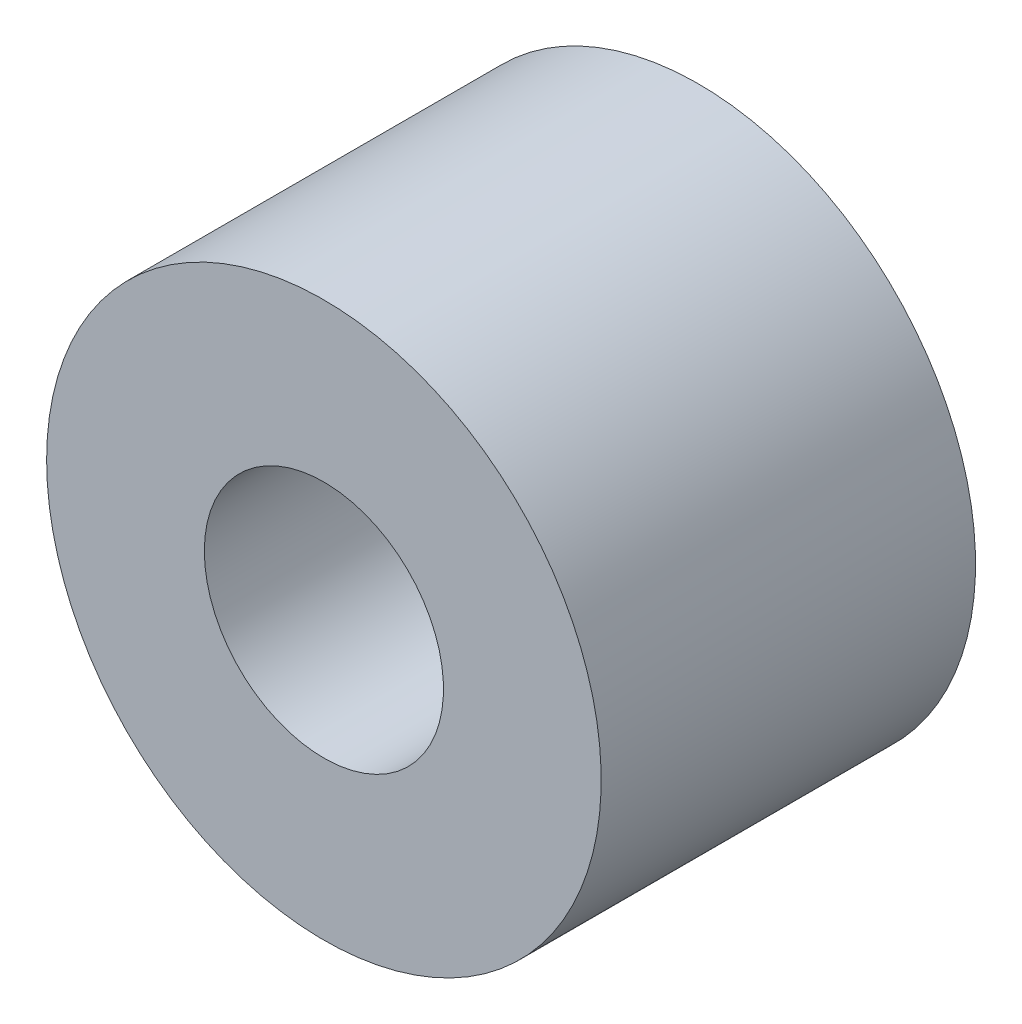
ISO-10303-21;
HEADER;
FILE_DESCRIPTION(('STEP AP214'),'2;1');
FILE_NAME('part.step','',(''),(''),'','','');
FILE_SCHEMA(('AUTOMOTIVE_DESIGN { 1 0 10303 214 1 1 1 1 }'));
ENDSEC;
DATA;
#1=APPLICATION_CONTEXT('core data for automotive mechanical design processes');
#2=APPLICATION_PROTOCOL_DEFINITION('international standard','automotive_design',2000,#1);
#3=PRODUCT_CONTEXT('',#1,'mechanical');
#4=PRODUCT('Part','Part','',(#3));
#5=PRODUCT_RELATED_PRODUCT_CATEGORY('part','',(#4));
#6=PRODUCT_DEFINITION_FORMATION('','',#4);
#7=PRODUCT_DEFINITION_CONTEXT('part definition',#1,'design');
#8=PRODUCT_DEFINITION('design','',#6,#7);
#9=PRODUCT_DEFINITION_SHAPE('','',#8);
#10=(LENGTH_UNIT() NAMED_UNIT(*) SI_UNIT(.MILLI.,.METRE.));
#11=(NAMED_UNIT(*) PLANE_ANGLE_UNIT() SI_UNIT($,.RADIAN.));
#12=(NAMED_UNIT(*) SI_UNIT($,.STERADIAN.) SOLID_ANGLE_UNIT());
#13=UNCERTAINTY_MEASURE_WITH_UNIT(LENGTH_MEASURE(1.E-05),#10,'distance_accuracy_value','');
#14=(GEOMETRIC_REPRESENTATION_CONTEXT(3) GLOBAL_UNCERTAINTY_ASSIGNED_CONTEXT((#13)) GLOBAL_UNIT_ASSIGNED_CONTEXT((#10,
#11,#12)) REPRESENTATION_CONTEXT('',''));
#15=CARTESIAN_POINT('',(0.,0.,0.));
#16=DIRECTION('',(0.,0.,1.));
#17=DIRECTION('',(1.,0.,0.));
#18=AXIS2_PLACEMENT_3D('',#15,#16,#17);
#19=CARTESIAN_POINT('',(0.,0.,5.4));
#20=DIRECTION('',(0.,0.,1.));
#21=DIRECTION('',(1.,0.,0.));
#22=AXIS2_PLACEMENT_3D('',#19,#20,#21);
#23=PLANE('',#22);
#24=CARTESIAN_POINT('',(0.,0.,5.4));
#25=DIRECTION('',(0.,0.,1.));
#26=DIRECTION('',(1.,0.,0.));
#27=AXIS2_PLACEMENT_3D('',#24,#25,#26);
#28=CIRCLE('',#27,4.);
#29=CARTESIAN_POINT('',(-4.,0.,5.4));
#30=VERTEX_POINT('',#29);
#31=EDGE_CURVE('E10',#30,#30,#28,.T.);
#32=ORIENTED_EDGE('',*,*,#31,.T.);
#33=EDGE_LOOP('',(#32));
#34=FACE_BOUND('',#33,.T.);
#35=CARTESIAN_POINT('',(0.,0.,5.4));
#36=DIRECTION('',(0.,0.,1.));
#37=DIRECTION('',(1.,0.,0.));
#38=AXIS2_PLACEMENT_3D('',#35,#36,#37);
#39=CIRCLE('',#38,1.725);
#40=CARTESIAN_POINT('',(-1.725,0.,5.4));
#41=VERTEX_POINT('',#40);
#42=EDGE_CURVE('E42',#41,#41,#39,.T.);
#43=ORIENTED_EDGE('',*,*,#42,.F.);
#44=EDGE_LOOP('',(#43));
#45=FACE_BOUND('',#44,.T.);
#46=ADVANCED_FACE('F31',(#34,#45),#23,.T.);
#47=CARTESIAN_POINT('',(0.,0.,0.));
#48=DIRECTION('',(0.,0.,1.));
#49=DIRECTION('',(1.,0.,0.));
#50=AXIS2_PLACEMENT_3D('',#47,#48,#49);
#51=PLANE('',#50);
#52=CARTESIAN_POINT('',(0.,0.,0.));
#53=DIRECTION('',(0.,0.,1.));
#54=DIRECTION('',(1.,0.,0.));
#55=AXIS2_PLACEMENT_3D('',#52,#53,#54);
#56=CIRCLE('',#55,4.);
#57=CARTESIAN_POINT('',(-4.,0.,0.));
#58=VERTEX_POINT('',#57);
#59=EDGE_CURVE('E35',#58,#58,#56,.T.);
#60=ORIENTED_EDGE('',*,*,#59,.F.);
#61=EDGE_LOOP('',(#60));
#62=FACE_BOUND('',#61,.T.);
#63=CARTESIAN_POINT('',(0.,0.,0.));
#64=DIRECTION('',(0.,0.,1.));
#65=DIRECTION('',(1.,0.,0.));
#66=AXIS2_PLACEMENT_3D('',#63,#64,#65);
#67=CIRCLE('',#66,1.725);
#68=CARTESIAN_POINT('',(-1.725,0.,0.));
#69=VERTEX_POINT('',#68);
#70=EDGE_CURVE('E44',#69,#69,#67,.T.);
#71=ORIENTED_EDGE('',*,*,#70,.T.);
#72=EDGE_LOOP('',(#71));
#73=FACE_BOUND('',#72,.T.);
#74=ADVANCED_FACE('F54',(#62,#73),#51,.F.);
#75=CARTESIAN_POINT('',(0.,0.,5.4));
#76=DIRECTION('',(0.,0.,-1.));
#77=DIRECTION('',(-1.,0.,0.));
#78=AXIS2_PLACEMENT_3D('',#75,#76,#77);
#79=CYLINDRICAL_SURFACE('',#78,4.);
#80=CARTESIAN_POINT('',(-4.,0.,5.4));
#81=CARTESIAN_POINT('',(-4.,0.,5.34375));
#82=CARTESIAN_POINT('',(-4.,0.,5.2875));
#83=CARTESIAN_POINT('',(-4.,0.,5.175));
#84=CARTESIAN_POINT('',(-4.,0.,5.11875));
#85=CARTESIAN_POINT('',(-4.,0.,5.00625));
#86=CARTESIAN_POINT('',(-4.,0.,4.95));
#87=CARTESIAN_POINT('',(-4.,0.,4.8375));
#88=CARTESIAN_POINT('',(-4.,0.,4.78125));
#89=CARTESIAN_POINT('',(-4.,0.,4.66875));
#90=CARTESIAN_POINT('',(-4.,0.,4.6125));
#91=CARTESIAN_POINT('',(-4.,0.,4.5));
#92=CARTESIAN_POINT('',(-4.,0.,4.44375));
#93=CARTESIAN_POINT('',(-4.,0.,4.33125));
#94=CARTESIAN_POINT('',(-4.,0.,4.275));
#95=CARTESIAN_POINT('',(-4.,0.,4.1625));
#96=CARTESIAN_POINT('',(-4.,0.,4.10625));
#97=CARTESIAN_POINT('',(-4.,0.,3.99375));
#98=CARTESIAN_POINT('',(-4.,0.,3.9375));
#99=CARTESIAN_POINT('',(-4.,0.,3.825));
#100=CARTESIAN_POINT('',(-4.,0.,3.76875));
#101=CARTESIAN_POINT('',(-4.,0.,3.65625));
#102=CARTESIAN_POINT('',(-4.,0.,3.6));
#103=CARTESIAN_POINT('',(-4.,0.,3.4875));
#104=CARTESIAN_POINT('',(-4.,0.,3.43125));
#105=CARTESIAN_POINT('',(-4.,0.,3.31875));
#106=CARTESIAN_POINT('',(-4.,0.,3.2625));
#107=CARTESIAN_POINT('',(-4.,0.,3.15));
#108=CARTESIAN_POINT('',(-4.,0.,3.09375));
#109=CARTESIAN_POINT('',(-4.,0.,2.98125));
#110=CARTESIAN_POINT('',(-4.,0.,2.925));
#111=CARTESIAN_POINT('',(-4.,0.,2.8125));
#112=CARTESIAN_POINT('',(-4.,0.,2.75625));
#113=CARTESIAN_POINT('',(-4.,0.,2.64375));
#114=CARTESIAN_POINT('',(-4.,0.,2.5875));
#115=CARTESIAN_POINT('',(-4.,0.,2.475));
#116=CARTESIAN_POINT('',(-4.,0.,2.41875));
#117=CARTESIAN_POINT('',(-4.,0.,2.30625));
#118=CARTESIAN_POINT('',(-4.,0.,2.25));
#119=CARTESIAN_POINT('',(-4.,0.,2.1375));
#120=CARTESIAN_POINT('',(-4.,0.,2.08125));
#121=CARTESIAN_POINT('',(-4.,0.,1.96875));
#122=CARTESIAN_POINT('',(-4.,0.,1.9125));
#123=CARTESIAN_POINT('',(-4.,0.,1.8));
#124=CARTESIAN_POINT('',(-4.,0.,1.74375));
#125=CARTESIAN_POINT('',(-4.,0.,1.63125));
#126=CARTESIAN_POINT('',(-4.,0.,1.575));
#127=CARTESIAN_POINT('',(-4.,0.,1.4625));
#128=CARTESIAN_POINT('',(-4.,0.,1.40625));
#129=CARTESIAN_POINT('',(-4.,0.,1.29375));
#130=CARTESIAN_POINT('',(-4.,0.,1.2375));
#131=CARTESIAN_POINT('',(-4.,0.,1.125));
#132=CARTESIAN_POINT('',(-4.,0.,1.06875));
#133=CARTESIAN_POINT('',(-4.,0.,0.95625));
#134=CARTESIAN_POINT('',(-4.,0.,0.9));
#135=CARTESIAN_POINT('',(-4.,0.,0.7875));
#136=CARTESIAN_POINT('',(-4.,0.,0.73125));
#137=CARTESIAN_POINT('',(-4.,0.,0.618749999999999));
#138=CARTESIAN_POINT('',(-4.,0.,0.562499999999999));
#139=CARTESIAN_POINT('',(-4.,0.,0.449999999999999));
#140=CARTESIAN_POINT('',(-4.,0.,0.393749999999999));
#141=CARTESIAN_POINT('',(-4.,0.,0.281249999999999));
#142=CARTESIAN_POINT('',(-4.,0.,0.225));
#143=CARTESIAN_POINT('',(-4.,0.,0.112499999999999));
#144=CARTESIAN_POINT('',(-4.,0.,0.0562499999999992));
#145=CARTESIAN_POINT('',(-4.,0.,0.));
#146=B_SPLINE_CURVE_WITH_KNOTS('',3,(#80,#81,#82,#83,#84,#85,#86,#87,#88,#89,#90,#91,#92,#93,
#94,#95,#96,#97,#98,#99,#100,#101,#102,#103,#104,#105,#106,#107,#108,#109,#110,#111,#112,#113,
#114,#115,#116,#117,#118,#119,#120,#121,#122,#123,#124,#125,#126,#127,#128,#129,#130,#131,#132,
#133,#134,#135,#136,#137,#138,#139,#140,#141,#142,#143,#144,#145),.UNSPECIFIED.,.F.,.F.,(4,2,2,
2,2,2,2,2,2,2,2,2,2,2,2,2,2,2,2,2,2,2,2,2,2,2,2,2,2,2,2,2,4),(0.,0.168750000000001,0.3375,
0.506250000000001,0.675,0.843750000000001,1.0125,1.18125,1.35,1.51875,1.6875,1.85625,2.025,
2.19375,2.3625,2.53125,2.7,2.86875,3.0375,3.20625,3.375,3.54375,3.7125,3.88125,4.05,4.21875,
4.3875,4.55625,4.725,4.89375,5.0625,5.23125,5.4),.UNSPECIFIED.);
#147=EDGE_CURVE('BSEAM33',#30,#58,#146,.T.);
#148=ORIENTED_EDGE('',*,*,#31,.F.);
#149=ORIENTED_EDGE('',*,*,#59,.T.);
#150=ORIENTED_EDGE('',*,*,#147,.T.);
#151=ORIENTED_EDGE('',*,*,#147,.F.);
#152=EDGE_LOOP('',(#148,#150,#149,#151));
#153=FACE_BOUND('',#152,.T.);
#154=ADVANCED_FACE('F33',(#153),#79,.T.);
#155=CARTESIAN_POINT('',(0.,0.,5.4));
#156=DIRECTION('',(0.,0.,-1.));
#157=DIRECTION('',(-1.,0.,0.));
#158=AXIS2_PLACEMENT_3D('',#155,#156,#157);
#159=CYLINDRICAL_SURFACE('',#158,1.725);
#160=CARTESIAN_POINT('',(-1.725,0.,5.4));
#161=CARTESIAN_POINT('',(-1.725,0.,5.34375));
#162=CARTESIAN_POINT('',(-1.725,0.,5.2875));
#163=CARTESIAN_POINT('',(-1.725,0.,5.175));
#164=CARTESIAN_POINT('',(-1.725,0.,5.11875));
#165=CARTESIAN_POINT('',(-1.725,0.,5.00625));
#166=CARTESIAN_POINT('',(-1.725,0.,4.95));
#167=CARTESIAN_POINT('',(-1.725,0.,4.8375));
#168=CARTESIAN_POINT('',(-1.725,0.,4.78125));
#169=CARTESIAN_POINT('',(-1.725,0.,4.66875));
#170=CARTESIAN_POINT('',(-1.725,0.,4.6125));
#171=CARTESIAN_POINT('',(-1.725,0.,4.5));
#172=CARTESIAN_POINT('',(-1.725,0.,4.44375));
#173=CARTESIAN_POINT('',(-1.725,0.,4.33125));
#174=CARTESIAN_POINT('',(-1.725,0.,4.275));
#175=CARTESIAN_POINT('',(-1.725,0.,4.1625));
#176=CARTESIAN_POINT('',(-1.725,0.,4.10625));
#177=CARTESIAN_POINT('',(-1.725,0.,3.99375));
#178=CARTESIAN_POINT('',(-1.725,0.,3.9375));
#179=CARTESIAN_POINT('',(-1.725,0.,3.825));
#180=CARTESIAN_POINT('',(-1.725,0.,3.76875));
#181=CARTESIAN_POINT('',(-1.725,0.,3.65625));
#182=CARTESIAN_POINT('',(-1.725,0.,3.6));
#183=CARTESIAN_POINT('',(-1.725,0.,3.4875));
#184=CARTESIAN_POINT('',(-1.725,0.,3.43125));
#185=CARTESIAN_POINT('',(-1.725,0.,3.31875));
#186=CARTESIAN_POINT('',(-1.725,0.,3.2625));
#187=CARTESIAN_POINT('',(-1.725,0.,3.15));
#188=CARTESIAN_POINT('',(-1.725,0.,3.09375));
#189=CARTESIAN_POINT('',(-1.725,0.,2.98125));
#190=CARTESIAN_POINT('',(-1.725,0.,2.925));
#191=CARTESIAN_POINT('',(-1.725,0.,2.8125));
#192=CARTESIAN_POINT('',(-1.725,0.,2.75625));
#193=CARTESIAN_POINT('',(-1.725,0.,2.64375));
#194=CARTESIAN_POINT('',(-1.725,0.,2.5875));
#195=CARTESIAN_POINT('',(-1.725,0.,2.475));
#196=CARTESIAN_POINT('',(-1.725,0.,2.41875));
#197=CARTESIAN_POINT('',(-1.725,0.,2.30625));
#198=CARTESIAN_POINT('',(-1.725,0.,2.25));
#199=CARTESIAN_POINT('',(-1.725,0.,2.1375));
#200=CARTESIAN_POINT('',(-1.725,0.,2.08125));
#201=CARTESIAN_POINT('',(-1.725,0.,1.96875));
#202=CARTESIAN_POINT('',(-1.725,0.,1.9125));
#203=CARTESIAN_POINT('',(-1.725,0.,1.8));
#204=CARTESIAN_POINT('',(-1.725,0.,1.74375));
#205=CARTESIAN_POINT('',(-1.725,0.,1.63125));
#206=CARTESIAN_POINT('',(-1.725,0.,1.575));
#207=CARTESIAN_POINT('',(-1.725,0.,1.4625));
#208=CARTESIAN_POINT('',(-1.725,0.,1.40625));
#209=CARTESIAN_POINT('',(-1.725,0.,1.29375));
#210=CARTESIAN_POINT('',(-1.725,0.,1.2375));
#211=CARTESIAN_POINT('',(-1.725,0.,1.125));
#212=CARTESIAN_POINT('',(-1.725,0.,1.06875));
#213=CARTESIAN_POINT('',(-1.725,0.,0.95625));
#214=CARTESIAN_POINT('',(-1.725,0.,0.9));
#215=CARTESIAN_POINT('',(-1.725,0.,0.7875));
#216=CARTESIAN_POINT('',(-1.725,0.,0.73125));
#217=CARTESIAN_POINT('',(-1.725,0.,0.618749999999999));
#218=CARTESIAN_POINT('',(-1.725,0.,0.562499999999999));
#219=CARTESIAN_POINT('',(-1.725,0.,0.449999999999999));
#220=CARTESIAN_POINT('',(-1.725,0.,0.393749999999999));
#221=CARTESIAN_POINT('',(-1.725,0.,0.281249999999999));
#222=CARTESIAN_POINT('',(-1.725,0.,0.225));
#223=CARTESIAN_POINT('',(-1.725,0.,0.112499999999999));
#224=CARTESIAN_POINT('',(-1.725,0.,0.0562499999999992));
#225=CARTESIAN_POINT('',(-1.725,0.,0.));
#226=B_SPLINE_CURVE_WITH_KNOTS('',3,(#160,#161,#162,#163,#164,#165,#166,#167,#168,#169,#170,
#171,#172,#173,#174,#175,#176,#177,#178,#179,#180,#181,#182,#183,#184,#185,#186,#187,#188,#189,
#190,#191,#192,#193,#194,#195,#196,#197,#198,#199,#200,#201,#202,#203,#204,#205,#206,#207,#208,
#209,#210,#211,#212,#213,#214,#215,#216,#217,#218,#219,#220,#221,#222,#223,#224,#225),
.UNSPECIFIED.,.F.,.F.,(4,2,2,2,2,2,2,2,2,2,2,2,2,2,2,2,2,2,2,2,2,2,2,2,2,2,2,2,2,2,2,2,4),(0.,
0.168750000000001,0.3375,0.506250000000001,0.675,0.843750000000001,1.0125,1.18125,1.35,1.51875,
1.6875,1.85625,2.025,2.19375,2.3625,2.53125,2.7,2.86875,3.0375,3.20625,3.375,3.54375,3.7125,
3.88125,4.05,4.21875,4.3875,4.55625,4.725,4.89375,5.0625,5.23125,5.4),.UNSPECIFIED.);
#227=EDGE_CURVE('BSEAM50',#41,#69,#226,.T.);
#228=ORIENTED_EDGE('',*,*,#42,.T.);
#229=ORIENTED_EDGE('',*,*,#70,.F.);
#230=ORIENTED_EDGE('',*,*,#227,.T.);
#231=ORIENTED_EDGE('',*,*,#227,.F.);
#232=EDGE_LOOP('',(#228,#230,#229,#231));
#233=FACE_BOUND('',#232,.T.);
#234=ADVANCED_FACE('F50',(#233),#159,.F.);
#235=CLOSED_SHELL('',(#46,#74,#154,#234));
#236=MANIFOLD_SOLID_BREP('B2',#235);
#237=ADVANCED_BREP_SHAPE_REPRESENTATION('',(#18,#236),#14);
#238=SHAPE_DEFINITION_REPRESENTATION(#9,#237);
ENDSEC;
END-ISO-10303-21;
